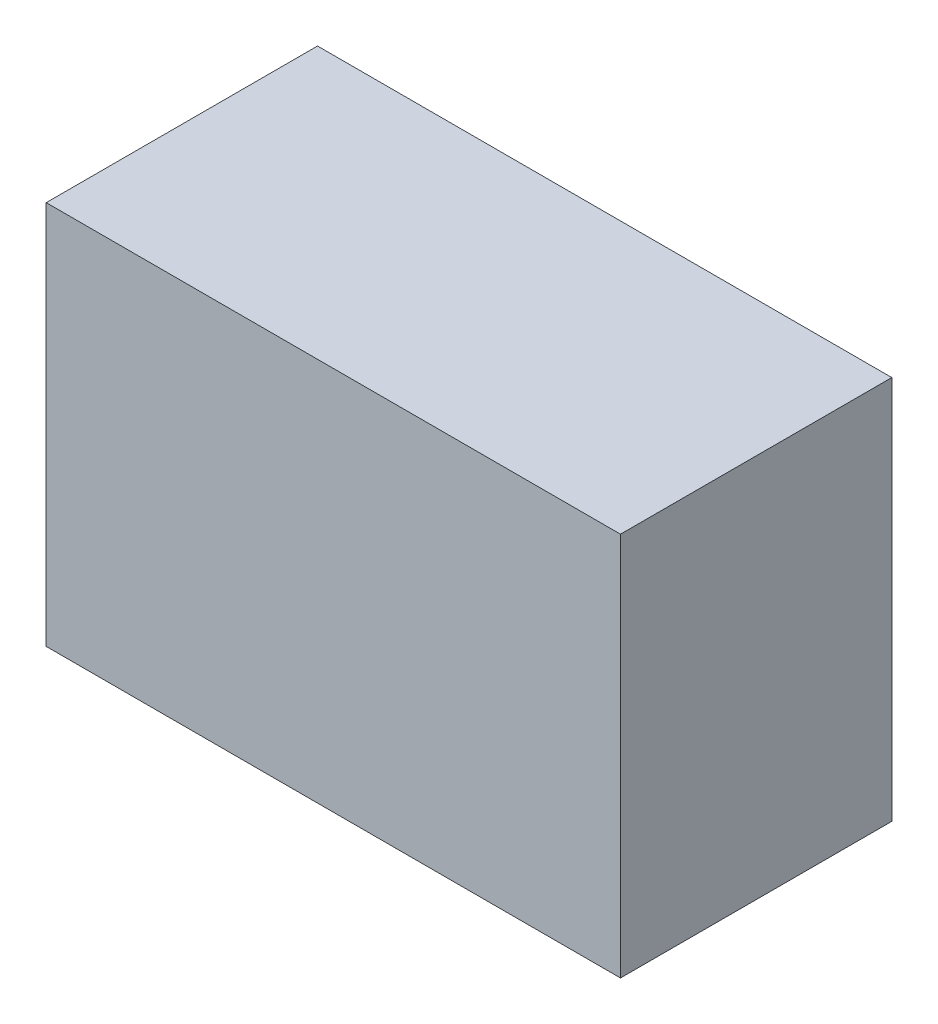
ISO-10303-21;
HEADER;
FILE_DESCRIPTION(('STEP AP214'),'2;1');
FILE_NAME('part.step','',(''),(''),'','','');
FILE_SCHEMA(('AUTOMOTIVE_DESIGN { 1 0 10303 214 1 1 1 1 }'));
ENDSEC;
DATA;
#1=APPLICATION_CONTEXT('core data for automotive mechanical design processes');
#2=APPLICATION_PROTOCOL_DEFINITION('international standard','automotive_design',2000,#1);
#3=PRODUCT_CONTEXT('',#1,'mechanical');
#4=PRODUCT('Part','Part','',(#3));
#5=PRODUCT_RELATED_PRODUCT_CATEGORY('part','',(#4));
#6=PRODUCT_DEFINITION_FORMATION('','',#4);
#7=PRODUCT_DEFINITION_CONTEXT('part definition',#1,'design');
#8=PRODUCT_DEFINITION('design','',#6,#7);
#9=PRODUCT_DEFINITION_SHAPE('','',#8);
#10=(LENGTH_UNIT() NAMED_UNIT(*) SI_UNIT(.MILLI.,.METRE.));
#11=(NAMED_UNIT(*) PLANE_ANGLE_UNIT() SI_UNIT($,.RADIAN.));
#12=(NAMED_UNIT(*) SI_UNIT($,.STERADIAN.) SOLID_ANGLE_UNIT());
#13=UNCERTAINTY_MEASURE_WITH_UNIT(LENGTH_MEASURE(1.E-05),#10,'distance_accuracy_value','');
#14=(GEOMETRIC_REPRESENTATION_CONTEXT(3) GLOBAL_UNCERTAINTY_ASSIGNED_CONTEXT((#13)) GLOBAL_UNIT_ASSIGNED_CONTEXT((#10,
#11,#12)) REPRESENTATION_CONTEXT('',''));
#15=CARTESIAN_POINT('',(0.,0.,0.));
#16=DIRECTION('',(0.,0.,1.));
#17=DIRECTION('',(1.,0.,0.));
#18=AXIS2_PLACEMENT_3D('',#15,#16,#17);
#19=CARTESIAN_POINT('',(31.75,-21.25,30.));
#20=DIRECTION('',(-1.,0.,0.));
#21=DIRECTION('',(0.,0.,1.));
#22=AXIS2_PLACEMENT_3D('',#19,#20,#21);
#23=PLANE('',#22);
#24=DIRECTION('',(0.,1.,0.));
#25=VECTOR('',#24,1.);
#26=CARTESIAN_POINT('',(31.75,-21.25,0.));
#27=LINE('',#26,#25);
#28=CARTESIAN_POINT('',(31.75,-21.25,0.));
#29=VERTEX_POINT('',#28);
#30=CARTESIAN_POINT('',(31.75,21.25,0.));
#31=VERTEX_POINT('',#30);
#32=EDGE_CURVE('E113',#29,#31,#27,.T.);
#33=ORIENTED_EDGE('',*,*,#32,.T.);
#34=DIRECTION('',(0.,0.,-1.));
#35=VECTOR('',#34,1.);
#36=CARTESIAN_POINT('',(31.75,21.25,30.));
#37=LINE('',#36,#35);
#38=CARTESIAN_POINT('',(31.75,21.25,30.));
#39=VERTEX_POINT('',#38);
#40=EDGE_CURVE('E11',#39,#31,#37,.T.);
#41=ORIENTED_EDGE('',*,*,#40,.F.);
#42=DIRECTION('',(0.,1.,0.));
#43=VECTOR('',#42,1.);
#44=CARTESIAN_POINT('',(31.75,-21.25,30.));
#45=LINE('',#44,#43);
#46=CARTESIAN_POINT('',(31.75,-21.25,30.));
#47=VERTEX_POINT('',#46);
#48=EDGE_CURVE('E97',#47,#39,#45,.T.);
#49=ORIENTED_EDGE('',*,*,#48,.F.);
#50=DIRECTION('',(0.,0.,-1.));
#51=VECTOR('',#50,1.);
#52=CARTESIAN_POINT('',(31.75,-21.25,30.));
#53=LINE('',#52,#51);
#54=EDGE_CURVE('E109',#47,#29,#53,.T.);
#55=ORIENTED_EDGE('',*,*,#54,.T.);
#56=EDGE_LOOP('',(#33,#41,#49,#55));
#57=FACE_BOUND('',#56,.T.);
#58=ADVANCED_FACE('F45',(#57),#23,.F.);
#59=CARTESIAN_POINT('',(-31.75,21.25,30.));
#60=DIRECTION('',(0.,-1.,0.));
#61=DIRECTION('',(0.,0.,-1.));
#62=AXIS2_PLACEMENT_3D('',#59,#60,#61);
#63=PLANE('',#62);
#64=DIRECTION('',(-1.,0.,0.));
#65=VECTOR('',#64,1.);
#66=CARTESIAN_POINT('',(-31.75,21.25,0.));
#67=LINE('',#66,#65);
#68=CARTESIAN_POINT('',(-31.75,21.25,0.));
#69=VERTEX_POINT('',#68);
#70=EDGE_CURVE('E102',#31,#69,#67,.T.);
#71=ORIENTED_EDGE('',*,*,#70,.T.);
#72=DIRECTION('',(0.,0.,-1.));
#73=VECTOR('',#72,1.);
#74=CARTESIAN_POINT('',(-31.75,21.25,30.));
#75=LINE('',#74,#73);
#76=CARTESIAN_POINT('',(-31.75,21.25,30.));
#77=VERTEX_POINT('',#76);
#78=EDGE_CURVE('E54',#77,#69,#75,.T.);
#79=ORIENTED_EDGE('',*,*,#78,.F.);
#80=DIRECTION('',(-1.,0.,0.));
#81=VECTOR('',#80,1.);
#82=CARTESIAN_POINT('',(-31.75,21.25,30.));
#83=LINE('',#82,#81);
#84=EDGE_CURVE('E92',#39,#77,#83,.T.);
#85=ORIENTED_EDGE('',*,*,#84,.F.);
#86=ORIENTED_EDGE('',*,*,#40,.T.);
#87=EDGE_LOOP('',(#71,#79,#85,#86));
#88=FACE_BOUND('',#87,.T.);
#89=ADVANCED_FACE('F101',(#88),#63,.F.);
#90=CARTESIAN_POINT('',(-31.75,-21.25,30.));
#91=DIRECTION('',(1.,0.,0.));
#92=DIRECTION('',(0.,0.,-1.));
#93=AXIS2_PLACEMENT_3D('',#90,#91,#92);
#94=PLANE('',#93);
#95=DIRECTION('',(0.,-1.,0.));
#96=VECTOR('',#95,1.);
#97=CARTESIAN_POINT('',(-31.75,-21.25,0.));
#98=LINE('',#97,#96);
#99=CARTESIAN_POINT('',(-31.75,-21.25,0.));
#100=VERTEX_POINT('',#99);
#101=EDGE_CURVE('E79',#69,#100,#98,.T.);
#102=ORIENTED_EDGE('',*,*,#101,.T.);
#103=DIRECTION('',(0.,0.,-1.));
#104=VECTOR('',#103,1.);
#105=CARTESIAN_POINT('',(-31.75,-21.25,30.));
#106=LINE('',#105,#104);
#107=CARTESIAN_POINT('',(-31.75,-21.25,30.));
#108=VERTEX_POINT('',#107);
#109=EDGE_CURVE('E104',#108,#100,#106,.T.);
#110=ORIENTED_EDGE('',*,*,#109,.F.);
#111=DIRECTION('',(0.,-1.,0.));
#112=VECTOR('',#111,1.);
#113=CARTESIAN_POINT('',(-31.75,-21.25,30.));
#114=LINE('',#113,#112);
#115=EDGE_CURVE('E95',#77,#108,#114,.T.);
#116=ORIENTED_EDGE('',*,*,#115,.F.);
#117=ORIENTED_EDGE('',*,*,#78,.T.);
#118=EDGE_LOOP('',(#102,#110,#116,#117));
#119=FACE_BOUND('',#118,.T.);
#120=ADVANCED_FACE('F105',(#119),#94,.F.);
#121=CARTESIAN_POINT('',(-31.75,-21.25,30.));
#122=DIRECTION('',(0.,1.,0.));
#123=DIRECTION('',(0.,0.,1.));
#124=AXIS2_PLACEMENT_3D('',#121,#122,#123);
#125=PLANE('',#124);
#126=DIRECTION('',(1.,0.,0.));
#127=VECTOR('',#126,1.);
#128=CARTESIAN_POINT('',(-31.75,-21.25,0.));
#129=LINE('',#128,#127);
#130=EDGE_CURVE('E85',#100,#29,#129,.T.);
#131=ORIENTED_EDGE('',*,*,#130,.T.);
#132=ORIENTED_EDGE('',*,*,#54,.F.);
#133=DIRECTION('',(1.,0.,0.));
#134=VECTOR('',#133,1.);
#135=CARTESIAN_POINT('',(-31.75,-21.25,30.));
#136=LINE('',#135,#134);
#137=EDGE_CURVE('E62',#108,#47,#136,.T.);
#138=ORIENTED_EDGE('',*,*,#137,.F.);
#139=ORIENTED_EDGE('',*,*,#109,.T.);
#140=EDGE_LOOP('',(#131,#132,#138,#139));
#141=FACE_BOUND('',#140,.T.);
#142=ADVANCED_FACE('F126',(#141),#125,.F.);
#143=CARTESIAN_POINT('',(0.,0.,30.));
#144=DIRECTION('',(0.,0.,-1.));
#145=DIRECTION('',(-1.,0.,0.));
#146=AXIS2_PLACEMENT_3D('',#143,#144,#145);
#147=PLANE('',#146);
#148=ORIENTED_EDGE('',*,*,#48,.T.);
#149=ORIENTED_EDGE('',*,*,#84,.T.);
#150=ORIENTED_EDGE('',*,*,#115,.T.);
#151=ORIENTED_EDGE('',*,*,#137,.T.);
#152=EDGE_LOOP('',(#148,#149,#150,#151));
#153=FACE_BOUND('',#152,.T.);
#154=ADVANCED_FACE('F93',(#153),#147,.F.);
#155=CARTESIAN_POINT('',(0.,0.,0.));
#156=DIRECTION('',(0.,0.,-1.));
#157=DIRECTION('',(-1.,0.,0.));
#158=AXIS2_PLACEMENT_3D('',#155,#156,#157);
#159=PLANE('',#158);
#160=ORIENTED_EDGE('',*,*,#32,.F.);
#161=ORIENTED_EDGE('',*,*,#130,.F.);
#162=ORIENTED_EDGE('',*,*,#101,.F.);
#163=ORIENTED_EDGE('',*,*,#70,.F.);
#164=EDGE_LOOP('',(#160,#161,#162,#163));
#165=FACE_BOUND('',#164,.T.);
#166=ADVANCED_FACE('F129',(#165),#159,.T.);
#167=CLOSED_SHELL('',(#58,#89,#120,#142,#154,#166));
#168=MANIFOLD_SOLID_BREP('B2',#167);
#169=ADVANCED_BREP_SHAPE_REPRESENTATION('',(#18,#168),#14);
#170=SHAPE_DEFINITION_REPRESENTATION(#9,#169);
ENDSEC;
END-ISO-10303-21;
